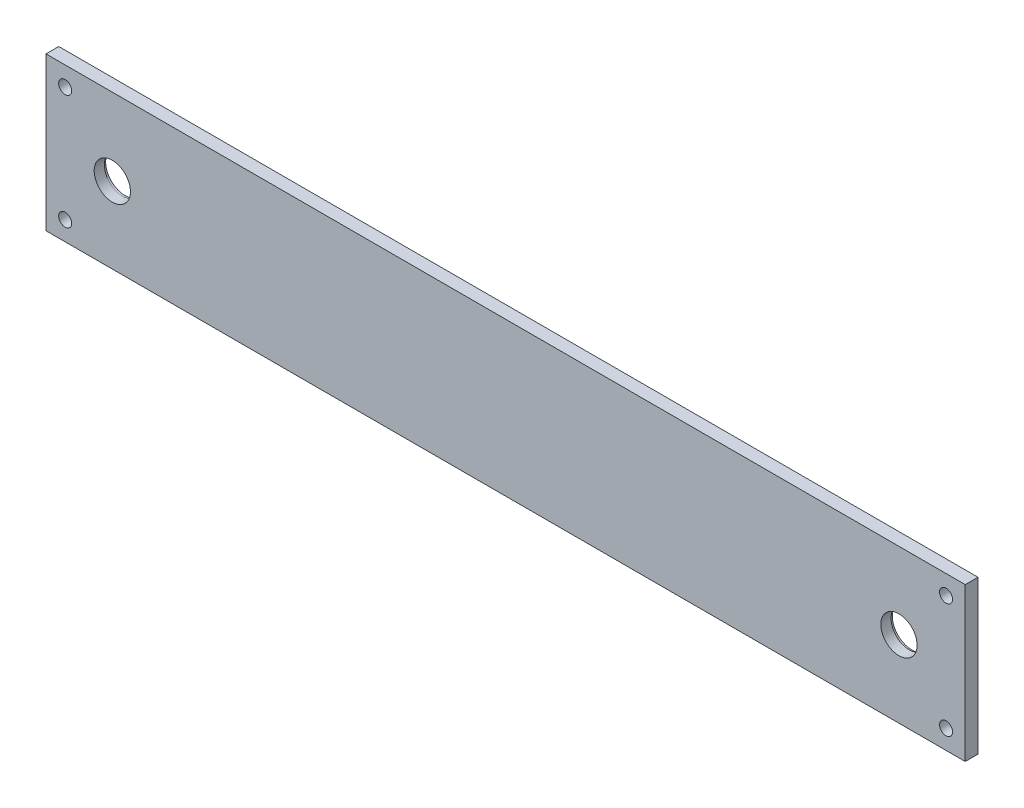
ISO-10303-21;
HEADER;
FILE_DESCRIPTION(('STEP AP214'),'2;1');
FILE_NAME('part.step','',(''),(''),'','','');
FILE_SCHEMA(('AUTOMOTIVE_DESIGN { 1 0 10303 214 1 1 1 1 }'));
ENDSEC;
DATA;
#1=APPLICATION_CONTEXT('core data for automotive mechanical design processes');
#2=APPLICATION_PROTOCOL_DEFINITION('international standard','automotive_design',2000,#1);
#3=PRODUCT_CONTEXT('',#1,'mechanical');
#4=PRODUCT('Part','Part','',(#3));
#5=PRODUCT_RELATED_PRODUCT_CATEGORY('part','',(#4));
#6=PRODUCT_DEFINITION_FORMATION('','',#4);
#7=PRODUCT_DEFINITION_CONTEXT('part definition',#1,'design');
#8=PRODUCT_DEFINITION('design','',#6,#7);
#9=PRODUCT_DEFINITION_SHAPE('','',#8);
#10=(LENGTH_UNIT() NAMED_UNIT(*) SI_UNIT(.MILLI.,.METRE.));
#11=(NAMED_UNIT(*) PLANE_ANGLE_UNIT() SI_UNIT($,.RADIAN.));
#12=(NAMED_UNIT(*) SI_UNIT($,.STERADIAN.) SOLID_ANGLE_UNIT());
#13=UNCERTAINTY_MEASURE_WITH_UNIT(LENGTH_MEASURE(1.E-05),#10,'distance_accuracy_value','');
#14=(GEOMETRIC_REPRESENTATION_CONTEXT(3) GLOBAL_UNCERTAINTY_ASSIGNED_CONTEXT((#13)) GLOBAL_UNIT_ASSIGNED_CONTEXT((#10,
#11,#12)) REPRESENTATION_CONTEXT('',''));
#15=CARTESIAN_POINT('',(0.,0.,0.));
#16=DIRECTION('',(0.,0.,1.));
#17=DIRECTION('',(1.,0.,0.));
#18=AXIS2_PLACEMENT_3D('',#15,#16,#17);
#19=CARTESIAN_POINT('',(0.,0.,0.));
#20=DIRECTION('',(0.,0.,1.));
#21=DIRECTION('',(1.,0.,0.));
#22=AXIS2_PLACEMENT_3D('',#19,#20,#21);
#23=PLANE('',#22);
#24=CARTESIAN_POINT('',(18.4513778825718,-22.492652976306,0.));
#25=DIRECTION('',(0.,0.,1.));
#26=DIRECTION('',(1.,0.,0.));
#27=AXIS2_PLACEMENT_3D('',#24,#25,#26);
#28=CIRCLE('',#27,2.55000000000001);
#29=CARTESIAN_POINT('',(21.0013778825718,-22.492652976306,0.));
#30=VERTEX_POINT('',#29);
#31=EDGE_CURVE('E214',#30,#30,#28,.T.);
#32=ORIENTED_EDGE('',*,*,#31,.F.);
#33=EDGE_LOOP('',(#32));
#34=FACE_BOUND('',#33,.T.);
#35=CARTESIAN_POINT('',(18.4513778825717,22.4926529763068,0.));
#36=DIRECTION('',(0.,0.,1.));
#37=DIRECTION('',(1.,0.,0.));
#38=AXIS2_PLACEMENT_3D('',#35,#36,#37);
#39=CIRCLE('',#38,2.54999999999999);
#40=CARTESIAN_POINT('',(21.0013778825717,22.4926529763068,0.));
#41=VERTEX_POINT('',#40);
#42=EDGE_CURVE('E208',#41,#41,#39,.F.);
#43=ORIENTED_EDGE('',*,*,#42,.T.);
#44=EDGE_LOOP('',(#43));
#45=FACE_BOUND('',#44,.T.);
#46=CARTESIAN_POINT('',(-326.533928070041,-22.4926529763064,0.));
#47=DIRECTION('',(0.,0.,1.));
#48=DIRECTION('',(1.,0.,0.));
#49=AXIS2_PLACEMENT_3D('',#46,#47,#48);
#50=CIRCLE('',#49,2.54999999999998);
#51=CARTESIAN_POINT('',(-323.983928070041,-22.4926529763064,0.));
#52=VERTEX_POINT('',#51);
#53=EDGE_CURVE('E224',#52,#52,#50,.F.);
#54=ORIENTED_EDGE('',*,*,#53,.T.);
#55=EDGE_LOOP('',(#54));
#56=FACE_BOUND('',#55,.T.);
#57=CARTESIAN_POINT('',(0.,0.,0.));
#58=DIRECTION('',(0.,0.,1.));
#59=DIRECTION('',(1.,0.,0.));
#60=AXIS2_PLACEMENT_3D('',#57,#58,#59);
#61=CIRCLE('',#60,7.1);
#62=CARTESIAN_POINT('',(7.1,0.,0.));
#63=VERTEX_POINT('',#62);
#64=EDGE_CURVE('E124',#63,#63,#61,.T.);
#65=ORIENTED_EDGE('',*,*,#64,.F.);
#66=EDGE_LOOP('',(#65));
#67=FACE_BOUND('',#66,.T.);
#68=CARTESIAN_POINT('',(-308.082550187469,-0.200000000000064,0.));
#69=DIRECTION('',(0.,0.,1.));
#70=DIRECTION('',(1.,0.,0.));
#71=AXIS2_PLACEMENT_3D('',#68,#69,#70);
#72=CIRCLE('',#71,7.09999999999998);
#73=CARTESIAN_POINT('',(-300.982550187469,-0.200000000000064,0.));
#74=VERTEX_POINT('',#73);
#75=EDGE_CURVE('E129',#74,#74,#72,.T.);
#76=ORIENTED_EDGE('',*,*,#75,.F.);
#77=EDGE_LOOP('',(#76));
#78=FACE_BOUND('',#77,.T.);
#79=DIRECTION('',(0.,1.,0.));
#80=VECTOR('',#79,1.);
#81=CARTESIAN_POINT('',(25.9587249062653,-30.,0.));
#82=LINE('',#81,#80);
#83=CARTESIAN_POINT('',(25.9587249062653,-30.,0.));
#84=VERTEX_POINT('',#83);
#85=CARTESIAN_POINT('',(25.9587249062653,30.,0.));
#86=VERTEX_POINT('',#85);
#87=EDGE_CURVE('E135',#84,#86,#82,.T.);
#88=ORIENTED_EDGE('',*,*,#87,.T.);
#89=DIRECTION('',(-1.,0.,0.));
#90=VECTOR('',#89,1.);
#91=CARTESIAN_POINT('',(25.9587249062653,30.,0.));
#92=LINE('',#91,#90);
#93=CARTESIAN_POINT('',(-334.041275093735,30.,0.));
#94=VERTEX_POINT('',#93);
#95=EDGE_CURVE('E98',#86,#94,#92,.T.);
#96=ORIENTED_EDGE('',*,*,#95,.T.);
#97=DIRECTION('',(0.,-1.,0.));
#98=VECTOR('',#97,1.);
#99=CARTESIAN_POINT('',(-334.041275093735,-30.,0.));
#100=LINE('',#99,#98);
#101=CARTESIAN_POINT('',(-334.041275093735,-30.,0.));
#102=VERTEX_POINT('',#101);
#103=EDGE_CURVE('E140',#94,#102,#100,.T.);
#104=ORIENTED_EDGE('',*,*,#103,.T.);
#105=DIRECTION('',(1.,0.,0.));
#106=VECTOR('',#105,1.);
#107=CARTESIAN_POINT('',(25.9587249062653,-30.,0.));
#108=LINE('',#107,#106);
#109=EDGE_CURVE('E102',#102,#84,#108,.T.);
#110=ORIENTED_EDGE('',*,*,#109,.T.);
#111=EDGE_LOOP('',(#88,#96,#104,#110));
#112=FACE_BOUND('',#111,.T.);
#113=CARTESIAN_POINT('',(-326.533928070041,22.4926529763065,0.));
#114=DIRECTION('',(0.,0.,1.));
#115=DIRECTION('',(1.,0.,0.));
#116=AXIS2_PLACEMENT_3D('',#113,#114,#115);
#117=CIRCLE('',#116,2.54999999999999);
#118=CARTESIAN_POINT('',(-323.983928070041,22.4926529763065,0.));
#119=VERTEX_POINT('',#118);
#120=EDGE_CURVE('E217',#119,#119,#117,.T.);
#121=ORIENTED_EDGE('',*,*,#120,.F.);
#122=EDGE_LOOP('',(#121));
#123=FACE_BOUND('',#122,.T.);
#124=ADVANCED_FACE('F49',(#34,#45,#56,#67,#78,#112,#123),#23,.T.);
#125=CARTESIAN_POINT('',(0.,0.,-5.));
#126=DIRECTION('',(0.,0.,-1.));
#127=DIRECTION('',(-1.,0.,0.));
#128=AXIS2_PLACEMENT_3D('',#125,#126,#127);
#129=PLANE('',#128);
#130=CARTESIAN_POINT('',(18.4513778825718,-22.492652976306,-5.));
#131=DIRECTION('',(0.,0.,1.));
#132=DIRECTION('',(1.,0.,0.));
#133=AXIS2_PLACEMENT_3D('',#130,#131,#132);
#134=CIRCLE('',#133,2.55000000000001);
#135=CARTESIAN_POINT('',(21.0013778825718,-22.492652976306,-5.));
#136=VERTEX_POINT('',#135);
#137=EDGE_CURVE('E221',#136,#136,#134,.T.);
#138=ORIENTED_EDGE('',*,*,#137,.T.);
#139=EDGE_LOOP('',(#138));
#140=FACE_BOUND('',#139,.T.);
#141=CARTESIAN_POINT('',(18.4513778825717,22.4926529763068,-5.));
#142=DIRECTION('',(0.,0.,-1.));
#143=DIRECTION('',(-1.,0.,0.));
#144=AXIS2_PLACEMENT_3D('',#141,#142,#143);
#145=CIRCLE('',#144,2.54999999999999);
#146=CARTESIAN_POINT('',(15.9013778825717,22.4926529763068,-5.));
#147=VERTEX_POINT('',#146);
#148=EDGE_CURVE('E211',#147,#147,#145,.T.);
#149=ORIENTED_EDGE('',*,*,#148,.F.);
#150=EDGE_LOOP('',(#149));
#151=FACE_BOUND('',#150,.T.);
#152=CARTESIAN_POINT('',(-326.533928070041,-22.4926529763064,-4.99999999999997));
#153=DIRECTION('',(0.,0.,-1.));
#154=DIRECTION('',(-1.,0.,0.));
#155=AXIS2_PLACEMENT_3D('',#152,#153,#154);
#156=CIRCLE('',#155,2.54999999999998);
#157=CARTESIAN_POINT('',(-329.083928070041,-22.4926529763064,-4.99999999999997));
#158=VERTEX_POINT('',#157);
#159=EDGE_CURVE('E229',#158,#158,#156,.T.);
#160=ORIENTED_EDGE('',*,*,#159,.F.);
#161=EDGE_LOOP('',(#160));
#162=FACE_BOUND('',#161,.T.);
#163=CARTESIAN_POINT('',(-308.082550187468,0.,-4.99999999999997));
#164=DIRECTION('',(0.,0.,1.));
#165=DIRECTION('',(1.,0.,0.));
#166=AXIS2_PLACEMENT_3D('',#163,#164,#165);
#167=CIRCLE('',#166,7.60000000000001);
#168=CARTESIAN_POINT('',(-300.482550187468,0.,-4.99999999999997));
#169=VERTEX_POINT('',#168);
#170=EDGE_CURVE('E116',#169,#169,#167,.T.);
#171=ORIENTED_EDGE('',*,*,#170,.T.);
#172=EDGE_LOOP('',(#171));
#173=FACE_BOUND('',#172,.T.);
#174=DIRECTION('',(1.,0.,0.));
#175=VECTOR('',#174,1.);
#176=CARTESIAN_POINT('',(0.,30.,-5.));
#177=LINE('',#176,#175);
#178=CARTESIAN_POINT('',(-334.041275093735,30.,-4.99999999999996));
#179=VERTEX_POINT('',#178);
#180=CARTESIAN_POINT('',(25.9587249062653,30.,-5.));
#181=VERTEX_POINT('',#180);
#182=EDGE_CURVE('E96',#179,#181,#177,.T.);
#183=ORIENTED_EDGE('',*,*,#182,.T.);
#184=DIRECTION('',(0.,-1.,0.));
#185=VECTOR('',#184,1.);
#186=CARTESIAN_POINT('',(25.9587249062653,0.,-5.));
#187=LINE('',#186,#185);
#188=CARTESIAN_POINT('',(25.9587249062653,-30.,-5.));
#189=VERTEX_POINT('',#188);
#190=EDGE_CURVE('E104',#181,#189,#187,.T.);
#191=ORIENTED_EDGE('',*,*,#190,.T.);
#192=DIRECTION('',(-1.,0.,0.));
#193=VECTOR('',#192,1.);
#194=CARTESIAN_POINT('',(0.,-30.,-5.));
#195=LINE('',#194,#193);
#196=CARTESIAN_POINT('',(-334.041275093735,-30.,-4.99999999999997));
#197=VERTEX_POINT('',#196);
#198=EDGE_CURVE('E107',#189,#197,#195,.T.);
#199=ORIENTED_EDGE('',*,*,#198,.T.);
#200=DIRECTION('',(0.,1.,0.));
#201=VECTOR('',#200,1.);
#202=CARTESIAN_POINT('',(-334.041275093735,0.,-4.99999999999996));
#203=LINE('',#202,#201);
#204=EDGE_CURVE('E112',#197,#179,#203,.T.);
#205=ORIENTED_EDGE('',*,*,#204,.T.);
#206=EDGE_LOOP('',(#183,#191,#199,#205));
#207=FACE_BOUND('',#206,.T.);
#208=CARTESIAN_POINT('',(0.,0.,-5.));
#209=DIRECTION('',(0.,0.,-1.));
#210=DIRECTION('',(-1.,0.,0.));
#211=AXIS2_PLACEMENT_3D('',#208,#209,#210);
#212=CIRCLE('',#211,7.6);
#213=CARTESIAN_POINT('',(-7.6,0.,-5.));
#214=VERTEX_POINT('',#213);
#215=EDGE_CURVE('E122',#214,#214,#212,.T.);
#216=ORIENTED_EDGE('',*,*,#215,.F.);
#217=EDGE_LOOP('',(#216));
#218=FACE_BOUND('',#217,.T.);
#219=CARTESIAN_POINT('',(-326.533928070041,22.4926529763065,-4.99999999999996));
#220=DIRECTION('',(0.,0.,-1.));
#221=DIRECTION('',(-1.,0.,0.));
#222=AXIS2_PLACEMENT_3D('',#219,#220,#221);
#223=CIRCLE('',#222,2.54999999999999);
#224=CARTESIAN_POINT('',(-329.083928070041,22.4926529763065,-4.99999999999996));
#225=VERTEX_POINT('',#224);
#226=EDGE_CURVE('E220',#225,#225,#223,.F.);
#227=ORIENTED_EDGE('',*,*,#226,.T.);
#228=EDGE_LOOP('',(#227));
#229=FACE_BOUND('',#228,.T.);
#230=ADVANCED_FACE('F110',(#140,#151,#162,#173,#207,#218,#229),#129,.T.);
#231=CARTESIAN_POINT('',(0.,0.,-4.));
#232=DIRECTION('',(0.,0.,1.));
#233=DIRECTION('',(1.,0.,0.));
#234=AXIS2_PLACEMENT_3D('',#231,#232,#233);
#235=PLANE('',#234);
#236=CARTESIAN_POINT('',(0.,0.,-4.));
#237=DIRECTION('',(0.,0.,1.));
#238=DIRECTION('',(1.,0.,0.));
#239=AXIS2_PLACEMENT_3D('',#236,#237,#238);
#240=CIRCLE('',#239,7.1);
#241=CARTESIAN_POINT('',(7.1,0.,-4.));
#242=VERTEX_POINT('',#241);
#243=EDGE_CURVE('E126',#242,#242,#240,.T.);
#244=ORIENTED_EDGE('',*,*,#243,.T.);
#245=EDGE_LOOP('',(#244));
#246=FACE_BOUND('',#245,.T.);
#247=CARTESIAN_POINT('',(0.,0.,-4.));
#248=DIRECTION('',(0.,0.,-1.));
#249=DIRECTION('',(-1.,0.,0.));
#250=AXIS2_PLACEMENT_3D('',#247,#248,#249);
#251=CIRCLE('',#250,7.6);
#252=CARTESIAN_POINT('',(-7.6,0.,-4.));
#253=VERTEX_POINT('',#252);
#254=EDGE_CURVE('E113',#253,#253,#251,.T.);
#255=ORIENTED_EDGE('',*,*,#254,.T.);
#256=EDGE_LOOP('',(#255));
#257=FACE_BOUND('',#256,.T.);
#258=ADVANCED_FACE('F156',(#246,#257),#235,.F.);
#259=CARTESIAN_POINT('',(25.9587249062653,-30.,-4.));
#260=DIRECTION('',(1.,0.,0.));
#261=DIRECTION('',(0.,0.,-1.));
#262=AXIS2_PLACEMENT_3D('',#259,#260,#261);
#263=PLANE('',#262);
#264=ORIENTED_EDGE('',*,*,#87,.F.);
#265=DIRECTION('',(0.,0.,1.));
#266=VECTOR('',#265,1.);
#267=CARTESIAN_POINT('',(25.9587249062653,-30.,-4.));
#268=LINE('',#267,#266);
#269=EDGE_CURVE('E58',#189,#84,#268,.T.);
#270=ORIENTED_EDGE('',*,*,#269,.F.);
#271=ORIENTED_EDGE('',*,*,#190,.F.);
#272=DIRECTION('',(0.,0.,1.));
#273=VECTOR('',#272,1.);
#274=CARTESIAN_POINT('',(25.9587249062653,30.,-4.));
#275=LINE('',#274,#273);
#276=EDGE_CURVE('E53',#181,#86,#275,.T.);
#277=ORIENTED_EDGE('',*,*,#276,.T.);
#278=EDGE_LOOP('',(#264,#270,#271,#277));
#279=FACE_BOUND('',#278,.T.);
#280=ADVANCED_FACE('F51',(#279),#263,.T.);
#281=CARTESIAN_POINT('',(25.9587249062653,-30.,-4.));
#282=DIRECTION('',(0.,-1.,0.));
#283=DIRECTION('',(0.,0.,-1.));
#284=AXIS2_PLACEMENT_3D('',#281,#282,#283);
#285=PLANE('',#284);
#286=ORIENTED_EDGE('',*,*,#109,.F.);
#287=DIRECTION('',(0.,0.,1.));
#288=VECTOR('',#287,1.);
#289=CARTESIAN_POINT('',(-334.041275093735,-30.,-4.));
#290=LINE('',#289,#288);
#291=EDGE_CURVE('E73',#197,#102,#290,.T.);
#292=ORIENTED_EDGE('',*,*,#291,.F.);
#293=ORIENTED_EDGE('',*,*,#198,.F.);
#294=ORIENTED_EDGE('',*,*,#269,.T.);
#295=EDGE_LOOP('',(#286,#292,#293,#294));
#296=FACE_BOUND('',#295,.T.);
#297=ADVANCED_FACE('F148',(#296),#285,.T.);
#298=CARTESIAN_POINT('',(-334.041275093735,-30.,-4.));
#299=DIRECTION('',(-1.,0.,0.));
#300=DIRECTION('',(0.,0.,1.));
#301=AXIS2_PLACEMENT_3D('',#298,#299,#300);
#302=PLANE('',#301);
#303=ORIENTED_EDGE('',*,*,#103,.F.);
#304=DIRECTION('',(0.,0.,1.));
#305=VECTOR('',#304,1.);
#306=CARTESIAN_POINT('',(-334.041275093735,30.,-4.));
#307=LINE('',#306,#305);
#308=EDGE_CURVE('E101',#179,#94,#307,.T.);
#309=ORIENTED_EDGE('',*,*,#308,.F.);
#310=ORIENTED_EDGE('',*,*,#204,.F.);
#311=ORIENTED_EDGE('',*,*,#291,.T.);
#312=EDGE_LOOP('',(#303,#309,#310,#311));
#313=FACE_BOUND('',#312,.T.);
#314=ADVANCED_FACE('F145',(#313),#302,.T.);
#315=CARTESIAN_POINT('',(25.9587249062653,30.,-4.));
#316=DIRECTION('',(0.,1.,0.));
#317=DIRECTION('',(0.,0.,1.));
#318=AXIS2_PLACEMENT_3D('',#315,#316,#317);
#319=PLANE('',#318);
#320=ORIENTED_EDGE('',*,*,#95,.F.);
#321=ORIENTED_EDGE('',*,*,#276,.F.);
#322=ORIENTED_EDGE('',*,*,#182,.F.);
#323=ORIENTED_EDGE('',*,*,#308,.T.);
#324=EDGE_LOOP('',(#320,#321,#322,#323));
#325=FACE_BOUND('',#324,.T.);
#326=ADVANCED_FACE('F94',(#325),#319,.T.);
#327=CARTESIAN_POINT('',(-308.082550187468,0.,-3.99999999999997));
#328=DIRECTION('',(0.,0.,1.));
#329=DIRECTION('',(1.,0.,0.));
#330=AXIS2_PLACEMENT_3D('',#327,#328,#329);
#331=CIRCLE('',#330,7.60000000000001);
#332=CARTESIAN_POINT('',(-300.482550187468,0.,-3.99999999999997));
#333=VERTEX_POINT('',#332);
#334=EDGE_CURVE('E12',#333,#333,#331,.T.);
#335=ORIENTED_EDGE('',*,*,#334,.F.);
#336=EDGE_LOOP('',(#335));
#337=FACE_BOUND('',#336,.T.);
#338=CARTESIAN_POINT('',(-308.082550187469,-0.200000000000064,-4.));
#339=DIRECTION('',(0.,0.,1.));
#340=DIRECTION('',(1.,0.,0.));
#341=AXIS2_PLACEMENT_3D('',#338,#339,#340);
#342=CIRCLE('',#341,7.09999999999998);
#343=CARTESIAN_POINT('',(-300.982550187469,-0.200000000000064,-4.));
#344=VERTEX_POINT('',#343);
#345=EDGE_CURVE('E132',#344,#344,#342,.T.);
#346=ORIENTED_EDGE('',*,*,#345,.T.);
#347=EDGE_LOOP('',(#346));
#348=FACE_BOUND('',#347,.T.);
#349=ADVANCED_FACE('F168',(#337,#348),#235,.F.);
#350=CARTESIAN_POINT('',(-308.082550187469,-0.200000000000064,-4.));
#351=DIRECTION('',(0.,0.,1.));
#352=DIRECTION('',(1.,0.,0.));
#353=AXIS2_PLACEMENT_3D('',#350,#351,#352);
#354=CYLINDRICAL_SURFACE('',#353,7.09999999999998);
#355=ORIENTED_EDGE('',*,*,#345,.F.);
#356=EDGE_LOOP('',(#355));
#357=FACE_BOUND('',#356,.T.);
#358=ORIENTED_EDGE('',*,*,#75,.T.);
#359=EDGE_LOOP('',(#358));
#360=FACE_BOUND('',#359,.T.);
#361=ADVANCED_FACE('F171',(#357,#360),#354,.F.);
#362=CARTESIAN_POINT('',(0.,0.,-4.));
#363=DIRECTION('',(0.,0.,1.));
#364=DIRECTION('',(1.,0.,0.));
#365=AXIS2_PLACEMENT_3D('',#362,#363,#364);
#366=CYLINDRICAL_SURFACE('',#365,7.1);
#367=ORIENTED_EDGE('',*,*,#243,.F.);
#368=EDGE_LOOP('',(#367));
#369=FACE_BOUND('',#368,.T.);
#370=ORIENTED_EDGE('',*,*,#64,.T.);
#371=EDGE_LOOP('',(#370));
#372=FACE_BOUND('',#371,.T.);
#373=ADVANCED_FACE('F175',(#369,#372),#366,.F.);
#374=CARTESIAN_POINT('',(0.,0.,-5.));
#375=DIRECTION('',(0.,0.,1.));
#376=DIRECTION('',(1.,0.,0.));
#377=AXIS2_PLACEMENT_3D('',#374,#375,#376);
#378=CYLINDRICAL_SURFACE('',#377,7.6);
#379=ORIENTED_EDGE('',*,*,#215,.T.);
#380=EDGE_LOOP('',(#379));
#381=FACE_BOUND('',#380,.T.);
#382=ORIENTED_EDGE('',*,*,#254,.F.);
#383=EDGE_LOOP('',(#382));
#384=FACE_BOUND('',#383,.T.);
#385=ADVANCED_FACE('F179',(#381,#384),#378,.F.);
#386=CARTESIAN_POINT('',(-308.082550187468,0.,-4.99999999999997));
#387=DIRECTION('',(0.,0.,1.));
#388=DIRECTION('',(1.,0.,0.));
#389=AXIS2_PLACEMENT_3D('',#386,#387,#388);
#390=CYLINDRICAL_SURFACE('',#389,7.60000000000001);
#391=ORIENTED_EDGE('',*,*,#170,.F.);
#392=EDGE_LOOP('',(#391));
#393=FACE_BOUND('',#392,.T.);
#394=ORIENTED_EDGE('',*,*,#334,.T.);
#395=EDGE_LOOP('',(#394));
#396=FACE_BOUND('',#395,.T.);
#397=ADVANCED_FACE('F182',(#393,#396),#390,.F.);
#398=CARTESIAN_POINT('',(-326.533928070041,-22.4926529763064,0.0010000000000383));
#399=DIRECTION('',(0.,0.,-1.));
#400=DIRECTION('',(-1.,0.,0.));
#401=AXIS2_PLACEMENT_3D('',#398,#399,#400);
#402=CYLINDRICAL_SURFACE('',#401,2.54999999999998);
#403=ORIENTED_EDGE('',*,*,#53,.F.);
#404=EDGE_LOOP('',(#403));
#405=FACE_BOUND('',#404,.T.);
#406=ORIENTED_EDGE('',*,*,#159,.T.);
#407=EDGE_LOOP('',(#406));
#408=FACE_BOUND('',#407,.T.);
#409=ADVANCED_FACE('F187',(#405,#408),#402,.F.);
#410=CARTESIAN_POINT('',(18.4513778825717,22.4926529763068,0.0010000000000036));
#411=DIRECTION('',(0.,0.,-1.));
#412=DIRECTION('',(-1.,0.,0.));
#413=AXIS2_PLACEMENT_3D('',#410,#411,#412);
#414=CYLINDRICAL_SURFACE('',#413,2.54999999999999);
#415=ORIENTED_EDGE('',*,*,#42,.F.);
#416=EDGE_LOOP('',(#415));
#417=FACE_BOUND('',#416,.T.);
#418=ORIENTED_EDGE('',*,*,#148,.T.);
#419=EDGE_LOOP('',(#418));
#420=FACE_BOUND('',#419,.T.);
#421=ADVANCED_FACE('F191',(#417,#420),#414,.F.);
#422=CARTESIAN_POINT('',(18.4513778825718,-22.492652976306,0.001000000000001));
#423=DIRECTION('',(0.,0.,-1.));
#424=DIRECTION('',(-1.,0.,0.));
#425=AXIS2_PLACEMENT_3D('',#422,#423,#424);
#426=CYLINDRICAL_SURFACE('',#425,2.55000000000001);
#427=ORIENTED_EDGE('',*,*,#31,.T.);
#428=EDGE_LOOP('',(#427));
#429=FACE_BOUND('',#428,.T.);
#430=ORIENTED_EDGE('',*,*,#137,.F.);
#431=EDGE_LOOP('',(#430));
#432=FACE_BOUND('',#431,.T.);
#433=ADVANCED_FACE('F193',(#429,#432),#426,.F.);
#434=CARTESIAN_POINT('',(-326.533928070041,22.4926529763065,0.0010000000000409));
#435=DIRECTION('',(0.,0.,-1.));
#436=DIRECTION('',(-1.,0.,0.));
#437=AXIS2_PLACEMENT_3D('',#434,#435,#436);
#438=CYLINDRICAL_SURFACE('',#437,2.54999999999999);
#439=ORIENTED_EDGE('',*,*,#120,.T.);
#440=EDGE_LOOP('',(#439));
#441=FACE_BOUND('',#440,.T.);
#442=ORIENTED_EDGE('',*,*,#226,.F.);
#443=EDGE_LOOP('',(#442));
#444=FACE_BOUND('',#443,.T.);
#445=ADVANCED_FACE('F196',(#441,#444),#438,.F.);
#446=CLOSED_SHELL('',(#124,#230,#258,#280,#297,#314,#326,#349,#361,#373,#385,#397,#409,#421,
#433,#445));
#447=MANIFOLD_SOLID_BREP('B2',#446);
#448=ADVANCED_BREP_SHAPE_REPRESENTATION('',(#18,#447),#14);
#449=SHAPE_DEFINITION_REPRESENTATION(#9,#448);
ENDSEC;
END-ISO-10303-21;
